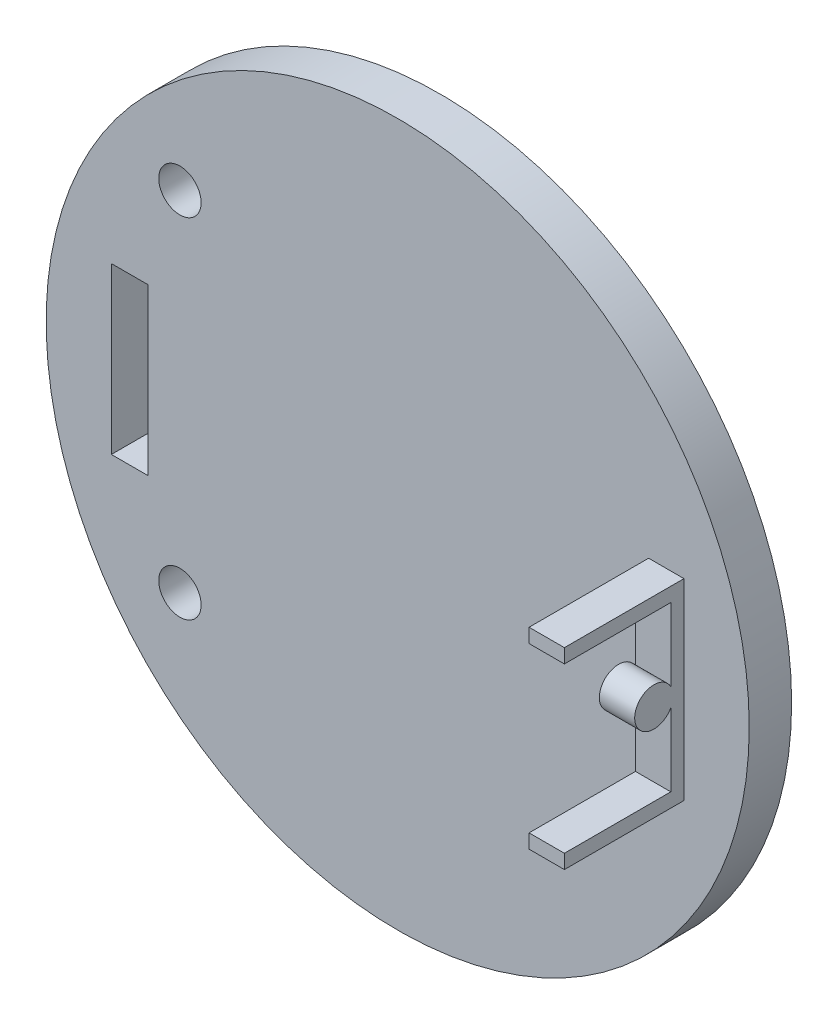
ISO-10303-21;
HEADER;
FILE_DESCRIPTION(('STEP AP214'),'2;1');
FILE_NAME('part.step','',(''),(''),'','','');
FILE_SCHEMA(('AUTOMOTIVE_DESIGN { 1 0 10303 214 1 1 1 1 }'));
ENDSEC;
DATA;
#1=APPLICATION_CONTEXT('core data for automotive mechanical design processes');
#2=APPLICATION_PROTOCOL_DEFINITION('international standard','automotive_design',2000,#1);
#3=PRODUCT_CONTEXT('',#1,'mechanical');
#4=PRODUCT('Part','Part','',(#3));
#5=PRODUCT_RELATED_PRODUCT_CATEGORY('part','',(#4));
#6=PRODUCT_DEFINITION_FORMATION('','',#4);
#7=PRODUCT_DEFINITION_CONTEXT('part definition',#1,'design');
#8=PRODUCT_DEFINITION('design','',#6,#7);
#9=PRODUCT_DEFINITION_SHAPE('','',#8);
#10=(LENGTH_UNIT() NAMED_UNIT(*) SI_UNIT(.MILLI.,.METRE.));
#11=(NAMED_UNIT(*) PLANE_ANGLE_UNIT() SI_UNIT($,.RADIAN.));
#12=(NAMED_UNIT(*) SI_UNIT($,.STERADIAN.) SOLID_ANGLE_UNIT());
#13=UNCERTAINTY_MEASURE_WITH_UNIT(LENGTH_MEASURE(1.E-05),#10,'distance_accuracy_value','');
#14=(GEOMETRIC_REPRESENTATION_CONTEXT(3) GLOBAL_UNCERTAINTY_ASSIGNED_CONTEXT((#13)) GLOBAL_UNIT_ASSIGNED_CONTEXT((#10,
#11,#12)) REPRESENTATION_CONTEXT('',''));
#15=CARTESIAN_POINT('',(0.,0.,0.));
#16=DIRECTION('',(0.,0.,1.));
#17=DIRECTION('',(1.,0.,0.));
#18=AXIS2_PLACEMENT_3D('',#15,#16,#17);
#19=CARTESIAN_POINT('',(0.,0.,8.46));
#20=DIRECTION('',(0.,0.,-1.));
#21=DIRECTION('',(-1.,0.,0.));
#22=AXIS2_PLACEMENT_3D('',#19,#20,#21);
#23=PLANE('',#22);
#24=DIRECTION('',(1.,0.,0.));
#25=VECTOR('',#24,1.);
#26=CARTESIAN_POINT('',(3.92599913973473,-5.8,8.46));
#27=LINE('',#26,#25);
#28=CARTESIAN_POINT('',(17.755,-5.8,8.46));
#29=VERTEX_POINT('',#28);
#30=CARTESIAN_POINT('',(20.255,-5.8,8.46));
#31=VERTEX_POINT('',#30);
#32=EDGE_CURVE('E246',#29,#31,#27,.T.);
#33=ORIENTED_EDGE('',*,*,#32,.F.);
#34=DIRECTION('',(0.,-1.,0.));
#35=VECTOR('',#34,1.);
#36=CARTESIAN_POINT('',(17.755,6.8,8.46));
#37=LINE('',#36,#35);
#38=CARTESIAN_POINT('',(17.755,-6.8,8.46));
#39=VERTEX_POINT('',#38);
#40=EDGE_CURVE('E278',#29,#39,#37,.T.);
#41=ORIENTED_EDGE('',*,*,#40,.T.);
#42=DIRECTION('',(1.,0.,0.));
#43=VECTOR('',#42,1.);
#44=CARTESIAN_POINT('',(17.755,-6.8,8.46));
#45=LINE('',#44,#43);
#46=CARTESIAN_POINT('',(20.255,-6.8,8.46));
#47=VERTEX_POINT('',#46);
#48=EDGE_CURVE('E274',#39,#47,#45,.T.);
#49=ORIENTED_EDGE('',*,*,#48,.T.);
#50=DIRECTION('',(0.,-1.,0.));
#51=VECTOR('',#50,1.);
#52=CARTESIAN_POINT('',(20.255,6.8,8.46));
#53=LINE('',#52,#51);
#54=EDGE_CURVE('E268',#31,#47,#53,.T.);
#55=ORIENTED_EDGE('',*,*,#54,.F.);
#56=EDGE_LOOP('',(#33,#41,#49,#55));
#57=FACE_BOUND('',#56,.T.);
#58=ADVANCED_FACE('F39',(#57),#23,.F.);
#59=DIRECTION('',(1.,0.,0.));
#60=VECTOR('',#59,1.);
#61=CARTESIAN_POINT('',(3.92599913973473,5.8,8.46));
#62=LINE('',#61,#60);
#63=CARTESIAN_POINT('',(17.755,5.8,8.46));
#64=VERTEX_POINT('',#63);
#65=CARTESIAN_POINT('',(20.255,5.8,8.46));
#66=VERTEX_POINT('',#65);
#67=EDGE_CURVE('E249',#64,#66,#62,.T.);
#68=ORIENTED_EDGE('',*,*,#67,.T.);
#69=CARTESIAN_POINT('',(20.255,6.8,8.46));
#70=VERTEX_POINT('',#69);
#71=EDGE_CURVE('E270',#70,#66,#53,.T.);
#72=ORIENTED_EDGE('',*,*,#71,.F.);
#73=DIRECTION('',(1.,0.,0.));
#74=VECTOR('',#73,1.);
#75=CARTESIAN_POINT('',(17.755,6.8,8.46));
#76=LINE('',#75,#74);
#77=CARTESIAN_POINT('',(17.755,6.8,8.46));
#78=VERTEX_POINT('',#77);
#79=EDGE_CURVE('E264',#78,#70,#76,.T.);
#80=ORIENTED_EDGE('',*,*,#79,.F.);
#81=EDGE_CURVE('E279',#78,#64,#37,.T.);
#82=ORIENTED_EDGE('',*,*,#81,.T.);
#83=EDGE_LOOP('',(#68,#72,#80,#82));
#84=FACE_BOUND('',#83,.T.);
#85=ADVANCED_FACE('F326',(#84),#23,.F.);
#86=CARTESIAN_POINT('',(0.,0.,-3.));
#87=DIRECTION('',(0.,0.,1.));
#88=DIRECTION('',(1.,0.,0.));
#89=AXIS2_PLACEMENT_3D('',#86,#87,#88);
#90=CYLINDRICAL_SURFACE('',#89,24.875);
#91=CARTESIAN_POINT('',(0.,0.,-3.));
#92=DIRECTION('',(0.,0.,1.));
#93=DIRECTION('',(1.,0.,0.));
#94=AXIS2_PLACEMENT_3D('',#91,#92,#93);
#95=CIRCLE('',#94,24.875);
#96=CARTESIAN_POINT('',(24.875,0.,-3.));
#97=VERTEX_POINT('',#96);
#98=EDGE_CURVE('E11',#97,#97,#95,.T.);
#99=ORIENTED_EDGE('',*,*,#98,.T.);
#100=EDGE_LOOP('',(#99));
#101=FACE_BOUND('',#100,.T.);
#102=CARTESIAN_POINT('',(0.,0.,0.));
#103=DIRECTION('',(0.,0.,1.));
#104=DIRECTION('',(1.,0.,0.));
#105=AXIS2_PLACEMENT_3D('',#102,#103,#104);
#106=CIRCLE('',#105,24.875);
#107=CARTESIAN_POINT('',(24.875,0.,0.));
#108=VERTEX_POINT('',#107);
#109=EDGE_CURVE('E43',#108,#108,#106,.T.);
#110=ORIENTED_EDGE('',*,*,#109,.F.);
#111=EDGE_LOOP('',(#110));
#112=FACE_BOUND('',#111,.T.);
#113=ADVANCED_FACE('F41',(#101,#112),#90,.T.);
#114=CARTESIAN_POINT('',(0.,0.,-3.));
#115=DIRECTION('',(0.,0.,1.));
#116=DIRECTION('',(1.,0.,0.));
#117=AXIS2_PLACEMENT_3D('',#114,#115,#116);
#118=PLANE('',#117);
#119=DIRECTION('',(-1.,0.,0.));
#120=VECTOR('',#119,1.);
#121=CARTESIAN_POINT('',(0.,5.84999999999999,-3.));
#122=LINE('',#121,#120);
#123=CARTESIAN_POINT('',(-17.66,5.85,-3.));
#124=VERTEX_POINT('',#123);
#125=CARTESIAN_POINT('',(-20.26,5.85,-3.));
#126=VERTEX_POINT('',#125);
#127=EDGE_CURVE('E181',#124,#126,#122,.T.);
#128=ORIENTED_EDGE('',*,*,#127,.T.);
#129=DIRECTION('',(0.,-1.,0.));
#130=VECTOR('',#129,1.);
#131=CARTESIAN_POINT('',(-20.26,0.,-3.));
#132=LINE('',#131,#130);
#133=CARTESIAN_POINT('',(-20.26,-5.85,-3.));
#134=VERTEX_POINT('',#133);
#135=EDGE_CURVE('E185',#126,#134,#132,.T.);
#136=ORIENTED_EDGE('',*,*,#135,.T.);
#137=DIRECTION('',(1.,0.,0.));
#138=VECTOR('',#137,1.);
#139=CARTESIAN_POINT('',(0.,-5.85,-3.));
#140=LINE('',#139,#138);
#141=CARTESIAN_POINT('',(-17.66,-5.85,-3.));
#142=VERTEX_POINT('',#141);
#143=EDGE_CURVE('E172',#134,#142,#140,.T.);
#144=ORIENTED_EDGE('',*,*,#143,.T.);
#145=DIRECTION('',(0.,1.,0.));
#146=VECTOR('',#145,1.);
#147=CARTESIAN_POINT('',(-17.66,0.,-3.));
#148=LINE('',#147,#146);
#149=EDGE_CURVE('E147',#142,#124,#148,.T.);
#150=ORIENTED_EDGE('',*,*,#149,.T.);
#151=EDGE_LOOP('',(#128,#136,#144,#150));
#152=FACE_BOUND('',#151,.T.);
#153=CARTESIAN_POINT('',(-15.4092069314207,12.7514449398056,-3.));
#154=DIRECTION('',(0.,0.,1.));
#155=DIRECTION('',(1.,0.,0.));
#156=AXIS2_PLACEMENT_3D('',#153,#154,#155);
#157=CIRCLE('',#156,1.5);
#158=CARTESIAN_POINT('',(-13.9092069314207,12.7514449398056,-3.));
#159=VERTEX_POINT('',#158);
#160=EDGE_CURVE('E201',#159,#159,#157,.T.);
#161=ORIENTED_EDGE('',*,*,#160,.T.);
#162=EDGE_LOOP('',(#161));
#163=FACE_BOUND('',#162,.T.);
#164=CARTESIAN_POINT('',(-15.4092069314207,-11.8993191986614,-3.));
#165=DIRECTION('',(0.,0.,1.));
#166=DIRECTION('',(1.,0.,0.));
#167=AXIS2_PLACEMENT_3D('',#164,#165,#166);
#168=CIRCLE('',#167,1.5);
#169=CARTESIAN_POINT('',(-13.9092069314207,-11.8993191986614,-3.));
#170=VERTEX_POINT('',#169);
#171=EDGE_CURVE('E194',#170,#170,#168,.T.);
#172=ORIENTED_EDGE('',*,*,#171,.T.);
#173=EDGE_LOOP('',(#172));
#174=FACE_BOUND('',#173,.T.);
#175=ORIENTED_EDGE('',*,*,#98,.F.);
#176=EDGE_LOOP('',(#175));
#177=FACE_BOUND('',#176,.T.);
#178=ADVANCED_FACE('F401',(#152,#163,#174,#177),#118,.F.);
#179=CARTESIAN_POINT('',(0.,0.,0.));
#180=DIRECTION('',(0.,0.,1.));
#181=DIRECTION('',(1.,0.,0.));
#182=AXIS2_PLACEMENT_3D('',#179,#180,#181);
#183=PLANE('',#182);
#184=DIRECTION('',(0.,-1.,0.));
#185=VECTOR('',#184,1.);
#186=CARTESIAN_POINT('',(-20.26,5.85,0.));
#187=LINE('',#186,#185);
#188=CARTESIAN_POINT('',(-20.26,5.85,0.));
#189=VERTEX_POINT('',#188);
#190=CARTESIAN_POINT('',(-20.26,-5.85,0.));
#191=VERTEX_POINT('',#190);
#192=EDGE_CURVE('E63',#189,#191,#187,.T.);
#193=ORIENTED_EDGE('',*,*,#192,.F.);
#194=DIRECTION('',(-1.,0.,0.));
#195=VECTOR('',#194,1.);
#196=CARTESIAN_POINT('',(-20.26,5.85,0.));
#197=LINE('',#196,#195);
#198=CARTESIAN_POINT('',(-17.66,5.85,0.));
#199=VERTEX_POINT('',#198);
#200=EDGE_CURVE('E162',#199,#189,#197,.T.);
#201=ORIENTED_EDGE('',*,*,#200,.F.);
#202=DIRECTION('',(0.,1.,0.));
#203=VECTOR('',#202,1.);
#204=CARTESIAN_POINT('',(-17.66,5.85,0.));
#205=LINE('',#204,#203);
#206=CARTESIAN_POINT('',(-17.66,-5.85,0.));
#207=VERTEX_POINT('',#206);
#208=EDGE_CURVE('E144',#207,#199,#205,.T.);
#209=ORIENTED_EDGE('',*,*,#208,.F.);
#210=DIRECTION('',(1.,0.,0.));
#211=VECTOR('',#210,1.);
#212=CARTESIAN_POINT('',(-20.26,-5.85,0.));
#213=LINE('',#212,#211);
#214=EDGE_CURVE('E154',#191,#207,#213,.T.);
#215=ORIENTED_EDGE('',*,*,#214,.F.);
#216=EDGE_LOOP('',(#193,#201,#209,#215));
#217=FACE_BOUND('',#216,.T.);
#218=CARTESIAN_POINT('',(-15.4092069314207,12.7514449398056,0.));
#219=DIRECTION('',(0.,0.,1.));
#220=DIRECTION('',(1.,0.,0.));
#221=AXIS2_PLACEMENT_3D('',#218,#219,#220);
#222=CIRCLE('',#221,1.5);
#223=CARTESIAN_POINT('',(-13.9092069314207,12.7514449398056,0.));
#224=VERTEX_POINT('',#223);
#225=EDGE_CURVE('E190',#224,#224,#222,.T.);
#226=ORIENTED_EDGE('',*,*,#225,.F.);
#227=EDGE_LOOP('',(#226));
#228=FACE_BOUND('',#227,.T.);
#229=CARTESIAN_POINT('',(-15.4092069314207,-11.8993191986614,0.));
#230=DIRECTION('',(0.,0.,1.));
#231=DIRECTION('',(1.,0.,0.));
#232=AXIS2_PLACEMENT_3D('',#229,#230,#231);
#233=CIRCLE('',#232,1.5);
#234=CARTESIAN_POINT('',(-13.9092069314207,-11.8993191986614,0.));
#235=VERTEX_POINT('',#234);
#236=EDGE_CURVE('E189',#235,#235,#233,.T.);
#237=ORIENTED_EDGE('',*,*,#236,.F.);
#238=EDGE_LOOP('',(#237));
#239=FACE_BOUND('',#238,.T.);
#240=DIRECTION('',(1.,0.,0.));
#241=VECTOR('',#240,1.);
#242=CARTESIAN_POINT('',(17.755,6.8,0.));
#243=LINE('',#242,#241);
#244=CARTESIAN_POINT('',(17.755,6.8,0.));
#245=VERTEX_POINT('',#244);
#246=CARTESIAN_POINT('',(20.255,6.8,0.));
#247=VERTEX_POINT('',#246);
#248=EDGE_CURVE('E263',#245,#247,#243,.T.);
#249=ORIENTED_EDGE('',*,*,#248,.T.);
#250=DIRECTION('',(0.,-1.,0.));
#251=VECTOR('',#250,1.);
#252=CARTESIAN_POINT('',(20.255,6.8,0.));
#253=LINE('',#252,#251);
#254=CARTESIAN_POINT('',(20.255,-6.8,0.));
#255=VERTEX_POINT('',#254);
#256=EDGE_CURVE('E286',#247,#255,#253,.T.);
#257=ORIENTED_EDGE('',*,*,#256,.T.);
#258=DIRECTION('',(1.,0.,0.));
#259=VECTOR('',#258,1.);
#260=CARTESIAN_POINT('',(17.755,-6.8,0.));
#261=LINE('',#260,#259);
#262=CARTESIAN_POINT('',(17.755,-6.8,0.));
#263=VERTEX_POINT('',#262);
#264=EDGE_CURVE('E289',#263,#255,#261,.T.);
#265=ORIENTED_EDGE('',*,*,#264,.F.);
#266=DIRECTION('',(0.,-1.,0.));
#267=VECTOR('',#266,1.);
#268=CARTESIAN_POINT('',(17.755,6.8,0.));
#269=LINE('',#268,#267);
#270=EDGE_CURVE('E269',#245,#263,#269,.T.);
#271=ORIENTED_EDGE('',*,*,#270,.F.);
#272=EDGE_LOOP('',(#249,#257,#265,#271));
#273=FACE_BOUND('',#272,.T.);
#274=ORIENTED_EDGE('',*,*,#109,.T.);
#275=EDGE_LOOP('',(#274));
#276=FACE_BOUND('',#275,.T.);
#277=ADVANCED_FACE('F159',(#217,#228,#239,#273,#276),#183,.T.);
#278=CARTESIAN_POINT('',(17.755,6.8,8.46));
#279=DIRECTION('',(0.,1.,0.));
#280=DIRECTION('',(-1.,0.,0.));
#281=AXIS2_PLACEMENT_3D('',#278,#279,#280);
#282=PLANE('',#281);
#283=ORIENTED_EDGE('',*,*,#248,.F.);
#284=DIRECTION('',(0.,0.,-1.));
#285=VECTOR('',#284,1.);
#286=CARTESIAN_POINT('',(17.755,6.8,8.46));
#287=LINE('',#286,#285);
#288=EDGE_CURVE('E296',#78,#245,#287,.T.);
#289=ORIENTED_EDGE('',*,*,#288,.F.);
#290=ORIENTED_EDGE('',*,*,#79,.T.);
#291=DIRECTION('',(0.,0.,-1.));
#292=VECTOR('',#291,1.);
#293=CARTESIAN_POINT('',(20.255,6.8,8.46));
#294=LINE('',#293,#292);
#295=EDGE_CURVE('E283',#70,#247,#294,.T.);
#296=ORIENTED_EDGE('',*,*,#295,.T.);
#297=EDGE_LOOP('',(#283,#289,#290,#296));
#298=FACE_BOUND('',#297,.T.);
#299=ADVANCED_FACE('F313',(#298),#282,.T.);
#300=CARTESIAN_POINT('',(17.755,6.8,8.46));
#301=DIRECTION('',(1.,0.,0.));
#302=DIRECTION('',(0.,1.,0.));
#303=AXIS2_PLACEMENT_3D('',#300,#301,#302);
#304=PLANE('',#303);
#305=DIRECTION('',(0.,0.,-1.));
#306=VECTOR('',#305,1.);
#307=CARTESIAN_POINT('',(17.755,-5.8,0.));
#308=LINE('',#307,#306);
#309=CARTESIAN_POINT('',(17.755,-5.8,0.931303911485231));
#310=VERTEX_POINT('',#309);
#311=EDGE_CURVE('E215',#29,#310,#308,.T.);
#312=ORIENTED_EDGE('',*,*,#311,.T.);
#313=DIRECTION('',(0.,1.,0.));
#314=VECTOR('',#313,1.);
#315=CARTESIAN_POINT('',(17.755,0.,0.931303911485232));
#316=LINE('',#315,#314);
#317=CARTESIAN_POINT('',(17.755,-0.649999999999997,0.931303911485233));
#318=VERTEX_POINT('',#317);
#319=EDGE_CURVE('E219',#310,#318,#316,.T.);
#320=ORIENTED_EDGE('',*,*,#319,.T.);
#321=CARTESIAN_POINT('',(17.755,0.,2.12591681950188));
#322=DIRECTION('',(1.,0.,0.));
#323=DIRECTION('',(0.,1.,0.));
#324=AXIS2_PLACEMENT_3D('',#321,#322,#323);
#325=CIRCLE('',#324,1.36);
#326=CARTESIAN_POINT('',(17.755,0.650000000000004,0.931303911485232));
#327=VERTEX_POINT('',#326);
#328=EDGE_CURVE('E223',#327,#318,#325,.T.);
#329=ORIENTED_EDGE('',*,*,#328,.F.);
#330=DIRECTION('',(0.,1.,0.));
#331=VECTOR('',#330,1.);
#332=CARTESIAN_POINT('',(17.755,0.,0.931303911485232));
#333=LINE('',#332,#331);
#334=CARTESIAN_POINT('',(17.755,5.8,0.931303911485232));
#335=VERTEX_POINT('',#334);
#336=EDGE_CURVE('E206',#327,#335,#333,.T.);
#337=ORIENTED_EDGE('',*,*,#336,.T.);
#338=DIRECTION('',(0.,0.,1.));
#339=VECTOR('',#338,1.);
#340=CARTESIAN_POINT('',(17.755,5.8,0.));
#341=LINE('',#340,#339);
#342=EDGE_CURVE('E210',#335,#64,#341,.T.);
#343=ORIENTED_EDGE('',*,*,#342,.T.);
#344=ORIENTED_EDGE('',*,*,#81,.F.);
#345=ORIENTED_EDGE('',*,*,#288,.T.);
#346=ORIENTED_EDGE('',*,*,#270,.T.);
#347=DIRECTION('',(0.,0.,-1.));
#348=VECTOR('',#347,1.);
#349=CARTESIAN_POINT('',(17.755,-6.8,8.46));
#350=LINE('',#349,#348);
#351=EDGE_CURVE('E300',#39,#263,#350,.T.);
#352=ORIENTED_EDGE('',*,*,#351,.F.);
#353=ORIENTED_EDGE('',*,*,#40,.F.);
#354=EDGE_LOOP('',(#312,#320,#329,#337,#343,#344,#345,#346,#352,#353));
#355=FACE_BOUND('',#354,.T.);
#356=ADVANCED_FACE('F324',(#355),#304,.F.);
#357=CARTESIAN_POINT('',(17.755,-6.8,8.46));
#358=DIRECTION('',(0.,1.,0.));
#359=DIRECTION('',(-1.,0.,0.));
#360=AXIS2_PLACEMENT_3D('',#357,#358,#359);
#361=PLANE('',#360);
#362=ORIENTED_EDGE('',*,*,#264,.T.);
#363=DIRECTION('',(0.,0.,-1.));
#364=VECTOR('',#363,1.);
#365=CARTESIAN_POINT('',(20.255,-6.8,8.46));
#366=LINE('',#365,#364);
#367=EDGE_CURVE('E304',#47,#255,#366,.T.);
#368=ORIENTED_EDGE('',*,*,#367,.F.);
#369=ORIENTED_EDGE('',*,*,#48,.F.);
#370=ORIENTED_EDGE('',*,*,#351,.T.);
#371=EDGE_LOOP('',(#362,#368,#369,#370));
#372=FACE_BOUND('',#371,.T.);
#373=ADVANCED_FACE('F354',(#372),#361,.F.);
#374=CARTESIAN_POINT('',(20.255,6.8,8.46));
#375=DIRECTION('',(1.,0.,0.));
#376=DIRECTION('',(0.,1.,0.));
#377=AXIS2_PLACEMENT_3D('',#374,#375,#376);
#378=PLANE('',#377);
#379=DIRECTION('',(0.,-1.,0.));
#380=VECTOR('',#379,1.);
#381=CARTESIAN_POINT('',(20.255,0.,0.931303911485232));
#382=LINE('',#381,#380);
#383=CARTESIAN_POINT('',(20.255,-0.649999999999995,0.931303911485232));
#384=VERTEX_POINT('',#383);
#385=CARTESIAN_POINT('',(20.255,-5.8,0.931303911485231));
#386=VERTEX_POINT('',#385);
#387=EDGE_CURVE('E205',#384,#386,#382,.T.);
#388=ORIENTED_EDGE('',*,*,#387,.T.);
#389=DIRECTION('',(0.,0.,1.));
#390=VECTOR('',#389,1.);
#391=CARTESIAN_POINT('',(20.255,-5.8,0.));
#392=LINE('',#391,#390);
#393=EDGE_CURVE('E239',#386,#31,#392,.T.);
#394=ORIENTED_EDGE('',*,*,#393,.T.);
#395=ORIENTED_EDGE('',*,*,#54,.T.);
#396=ORIENTED_EDGE('',*,*,#367,.T.);
#397=ORIENTED_EDGE('',*,*,#256,.F.);
#398=ORIENTED_EDGE('',*,*,#295,.F.);
#399=ORIENTED_EDGE('',*,*,#71,.T.);
#400=DIRECTION('',(0.,0.,-1.));
#401=VECTOR('',#400,1.);
#402=CARTESIAN_POINT('',(20.255,5.8,0.));
#403=LINE('',#402,#401);
#404=CARTESIAN_POINT('',(20.255,5.8,0.931303911485232));
#405=VERTEX_POINT('',#404);
#406=EDGE_CURVE('E235',#66,#405,#403,.T.);
#407=ORIENTED_EDGE('',*,*,#406,.T.);
#408=DIRECTION('',(0.,-1.,0.));
#409=VECTOR('',#408,1.);
#410=CARTESIAN_POINT('',(20.255,0.,0.931303911485232));
#411=LINE('',#410,#409);
#412=CARTESIAN_POINT('',(20.255,0.650000000000005,0.931303911485232));
#413=VERTEX_POINT('',#412);
#414=EDGE_CURVE('E231',#405,#413,#411,.T.);
#415=ORIENTED_EDGE('',*,*,#414,.T.);
#416=CARTESIAN_POINT('',(20.255,0.,2.12591681950188));
#417=DIRECTION('',(1.,0.,0.));
#418=DIRECTION('',(0.,1.,0.));
#419=AXIS2_PLACEMENT_3D('',#416,#417,#418);
#420=CIRCLE('',#419,1.36);
#421=EDGE_CURVE('E227',#384,#413,#420,.F.);
#422=ORIENTED_EDGE('',*,*,#421,.F.);
#423=EDGE_LOOP('',(#388,#394,#395,#396,#397,#398,#399,#407,#415,#422));
#424=FACE_BOUND('',#423,.T.);
#425=ADVANCED_FACE('F317',(#424),#378,.T.);
#426=CARTESIAN_POINT('',(3.92599913973473,0.,0.931303911485232));
#427=DIRECTION('',(0.,0.,1.));
#428=DIRECTION('',(0.,-1.,0.));
#429=AXIS2_PLACEMENT_3D('',#426,#427,#428);
#430=PLANE('',#429);
#431=DIRECTION('',(1.,0.,0.));
#432=VECTOR('',#431,1.);
#433=CARTESIAN_POINT('',(3.92599913973473,-5.8,0.931303911485231));
#434=LINE('',#433,#432);
#435=EDGE_CURVE('E211',#310,#386,#434,.T.);
#436=ORIENTED_EDGE('',*,*,#435,.T.);
#437=ORIENTED_EDGE('',*,*,#387,.F.);
#438=DIRECTION('',(1.,0.,0.));
#439=VECTOR('',#438,1.);
#440=CARTESIAN_POINT('',(3.92599913973473,-0.65,0.931303911485232));
#441=LINE('',#440,#439);
#442=EDGE_CURVE('E243',#318,#384,#441,.T.);
#443=ORIENTED_EDGE('',*,*,#442,.F.);
#444=ORIENTED_EDGE('',*,*,#319,.F.);
#445=EDGE_LOOP('',(#436,#437,#443,#444));
#446=FACE_BOUND('',#445,.T.);
#447=ADVANCED_FACE('F343',(#446),#430,.T.);
#448=CARTESIAN_POINT('',(3.92599913973473,-5.8,0.));
#449=DIRECTION('',(0.,1.,0.));
#450=DIRECTION('',(-1.,0.,0.));
#451=AXIS2_PLACEMENT_3D('',#448,#449,#450);
#452=PLANE('',#451);
#453=ORIENTED_EDGE('',*,*,#32,.T.);
#454=ORIENTED_EDGE('',*,*,#393,.F.);
#455=ORIENTED_EDGE('',*,*,#435,.F.);
#456=ORIENTED_EDGE('',*,*,#311,.F.);
#457=EDGE_LOOP('',(#453,#454,#455,#456));
#458=FACE_BOUND('',#457,.T.);
#459=ADVANCED_FACE('F346',(#458),#452,.T.);
#460=CARTESIAN_POINT('',(3.92599913973473,5.8,0.));
#461=DIRECTION('',(0.,-1.,0.));
#462=DIRECTION('',(1.,0.,0.));
#463=AXIS2_PLACEMENT_3D('',#460,#461,#462);
#464=PLANE('',#463);
#465=DIRECTION('',(1.,0.,0.));
#466=VECTOR('',#465,1.);
#467=CARTESIAN_POINT('',(3.92599913973473,5.8,0.931303911485232));
#468=LINE('',#467,#466);
#469=EDGE_CURVE('E253',#335,#405,#468,.T.);
#470=ORIENTED_EDGE('',*,*,#469,.T.);
#471=ORIENTED_EDGE('',*,*,#406,.F.);
#472=ORIENTED_EDGE('',*,*,#67,.F.);
#473=ORIENTED_EDGE('',*,*,#342,.F.);
#474=EDGE_LOOP('',(#470,#471,#472,#473));
#475=FACE_BOUND('',#474,.T.);
#476=ADVANCED_FACE('F330',(#475),#464,.T.);
#477=CARTESIAN_POINT('',(3.92599913973473,0.,0.931303911485232));
#478=DIRECTION('',(0.,0.,1.));
#479=DIRECTION('',(0.,-1.,0.));
#480=AXIS2_PLACEMENT_3D('',#477,#478,#479);
#481=PLANE('',#480);
#482=DIRECTION('',(1.,0.,0.));
#483=VECTOR('',#482,1.);
#484=CARTESIAN_POINT('',(3.92599913973473,0.65,0.931303911485232));
#485=LINE('',#484,#483);
#486=EDGE_CURVE('E256',#327,#413,#485,.T.);
#487=ORIENTED_EDGE('',*,*,#486,.T.);
#488=ORIENTED_EDGE('',*,*,#414,.F.);
#489=ORIENTED_EDGE('',*,*,#469,.F.);
#490=ORIENTED_EDGE('',*,*,#336,.F.);
#491=EDGE_LOOP('',(#487,#488,#489,#490));
#492=FACE_BOUND('',#491,.T.);
#493=ADVANCED_FACE('F333',(#492),#481,.T.);
#494=CARTESIAN_POINT('',(3.92599913973473,0.,2.12591681950188));
#495=DIRECTION('',(1.,0.,0.));
#496=DIRECTION('',(0.,1.,0.));
#497=AXIS2_PLACEMENT_3D('',#494,#495,#496);
#498=CYLINDRICAL_SURFACE('',#497,1.36);
#499=ORIENTED_EDGE('',*,*,#328,.T.);
#500=ORIENTED_EDGE('',*,*,#442,.T.);
#501=ORIENTED_EDGE('',*,*,#421,.T.);
#502=ORIENTED_EDGE('',*,*,#486,.F.);
#503=EDGE_LOOP('',(#499,#500,#501,#502));
#504=FACE_BOUND('',#503,.T.);
#505=ADVANCED_FACE('F337',(#504),#498,.T.);
#506=CARTESIAN_POINT('',(-15.4092069314207,-11.8993191986614,-4.95));
#507=DIRECTION('',(0.,0.,1.));
#508=DIRECTION('',(1.,0.,0.));
#509=AXIS2_PLACEMENT_3D('',#506,#507,#508);
#510=CYLINDRICAL_SURFACE('',#509,1.5);
#511=CARTESIAN_POINT('',(-13.9092069314207,-11.8993191986614,0.));
#512=CARTESIAN_POINT('',(-13.9092069314207,-11.8993191986614,-0.03125));
#513=CARTESIAN_POINT('',(-13.9092069314207,-11.8993191986614,-0.0625000000000001));
#514=CARTESIAN_POINT('',(-13.9092069314207,-11.8993191986614,-0.125));
#515=CARTESIAN_POINT('',(-13.9092069314207,-11.8993191986614,-0.15625));
#516=CARTESIAN_POINT('',(-13.9092069314207,-11.8993191986614,-0.21875));
#517=CARTESIAN_POINT('',(-13.9092069314207,-11.8993191986614,-0.25));
#518=CARTESIAN_POINT('',(-13.9092069314207,-11.8993191986614,-0.3125));
#519=CARTESIAN_POINT('',(-13.9092069314207,-11.8993191986614,-0.34375));
#520=CARTESIAN_POINT('',(-13.9092069314207,-11.8993191986614,-0.40625));
#521=CARTESIAN_POINT('',(-13.9092069314207,-11.8993191986614,-0.4375));
#522=CARTESIAN_POINT('',(-13.9092069314207,-11.8993191986614,-0.5));
#523=CARTESIAN_POINT('',(-13.9092069314207,-11.8993191986614,-0.53125));
#524=CARTESIAN_POINT('',(-13.9092069314207,-11.8993191986614,-0.593750000000001));
#525=CARTESIAN_POINT('',(-13.9092069314207,-11.8993191986614,-0.625000000000001));
#526=CARTESIAN_POINT('',(-13.9092069314207,-11.8993191986614,-0.687500000000001));
#527=CARTESIAN_POINT('',(-13.9092069314207,-11.8993191986614,-0.718750000000001));
#528=CARTESIAN_POINT('',(-13.9092069314207,-11.8993191986614,-0.781250000000001));
#529=CARTESIAN_POINT('',(-13.9092069314207,-11.8993191986614,-0.812500000000001));
#530=CARTESIAN_POINT('',(-13.9092069314207,-11.8993191986614,-0.875));
#531=CARTESIAN_POINT('',(-13.9092069314207,-11.8993191986614,-0.90625));
#532=CARTESIAN_POINT('',(-13.9092069314207,-11.8993191986614,-0.96875));
#533=CARTESIAN_POINT('',(-13.9092069314207,-11.8993191986614,-1.));
#534=CARTESIAN_POINT('',(-13.9092069314207,-11.8993191986614,-1.0625));
#535=CARTESIAN_POINT('',(-13.9092069314207,-11.8993191986614,-1.09375));
#536=CARTESIAN_POINT('',(-13.9092069314207,-11.8993191986614,-1.15625));
#537=CARTESIAN_POINT('',(-13.9092069314207,-11.8993191986614,-1.1875));
#538=CARTESIAN_POINT('',(-13.9092069314207,-11.8993191986614,-1.25));
#539=CARTESIAN_POINT('',(-13.9092069314207,-11.8993191986614,-1.28125));
#540=CARTESIAN_POINT('',(-13.9092069314207,-11.8993191986614,-1.34375));
#541=CARTESIAN_POINT('',(-13.9092069314207,-11.8993191986614,-1.375));
#542=CARTESIAN_POINT('',(-13.9092069314207,-11.8993191986614,-1.4375));
#543=CARTESIAN_POINT('',(-13.9092069314207,-11.8993191986614,-1.46875));
#544=CARTESIAN_POINT('',(-13.9092069314207,-11.8993191986614,-1.53125));
#545=CARTESIAN_POINT('',(-13.9092069314207,-11.8993191986614,-1.5625));
#546=CARTESIAN_POINT('',(-13.9092069314207,-11.8993191986614,-1.625));
#547=CARTESIAN_POINT('',(-13.9092069314207,-11.8993191986614,-1.65625));
#548=CARTESIAN_POINT('',(-13.9092069314207,-11.8993191986614,-1.71875));
#549=CARTESIAN_POINT('',(-13.9092069314207,-11.8993191986614,-1.75));
#550=CARTESIAN_POINT('',(-13.9092069314207,-11.8993191986614,-1.8125));
#551=CARTESIAN_POINT('',(-13.9092069314207,-11.8993191986614,-1.84375));
#552=CARTESIAN_POINT('',(-13.9092069314207,-11.8993191986614,-1.90625));
#553=CARTESIAN_POINT('',(-13.9092069314207,-11.8993191986614,-1.9375));
#554=CARTESIAN_POINT('',(-13.9092069314207,-11.8993191986614,-2.));
#555=CARTESIAN_POINT('',(-13.9092069314207,-11.8993191986614,-2.03125));
#556=CARTESIAN_POINT('',(-13.9092069314207,-11.8993191986614,-2.09375));
#557=CARTESIAN_POINT('',(-13.9092069314207,-11.8993191986614,-2.125));
#558=CARTESIAN_POINT('',(-13.9092069314207,-11.8993191986614,-2.1875));
#559=CARTESIAN_POINT('',(-13.9092069314207,-11.8993191986614,-2.21875));
#560=CARTESIAN_POINT('',(-13.9092069314207,-11.8993191986614,-2.28125));
#561=CARTESIAN_POINT('',(-13.9092069314207,-11.8993191986614,-2.3125));
#562=CARTESIAN_POINT('',(-13.9092069314207,-11.8993191986614,-2.375));
#563=CARTESIAN_POINT('',(-13.9092069314207,-11.8993191986614,-2.40625));
#564=CARTESIAN_POINT('',(-13.9092069314207,-11.8993191986614,-2.46875));
#565=CARTESIAN_POINT('',(-13.9092069314207,-11.8993191986614,-2.5));
#566=CARTESIAN_POINT('',(-13.9092069314207,-11.8993191986614,-2.5625));
#567=CARTESIAN_POINT('',(-13.9092069314207,-11.8993191986614,-2.59375));
#568=CARTESIAN_POINT('',(-13.9092069314207,-11.8993191986614,-2.65625));
#569=CARTESIAN_POINT('',(-13.9092069314207,-11.8993191986614,-2.6875));
#570=CARTESIAN_POINT('',(-13.9092069314207,-11.8993191986614,-2.75));
#571=CARTESIAN_POINT('',(-13.9092069314207,-11.8993191986614,-2.78125));
#572=CARTESIAN_POINT('',(-13.9092069314207,-11.8993191986614,-2.84375));
#573=CARTESIAN_POINT('',(-13.9092069314207,-11.8993191986614,-2.875));
#574=CARTESIAN_POINT('',(-13.9092069314207,-11.8993191986614,-2.9375));
#575=CARTESIAN_POINT('',(-13.9092069314207,-11.8993191986614,-2.96875));
#576=CARTESIAN_POINT('',(-13.9092069314207,-11.8993191986614,-3.));
#577=B_SPLINE_CURVE_WITH_KNOTS('',3,(#511,#512,#513,#514,#515,#516,#517,#518,#519,#520,#521,
#522,#523,#524,#525,#526,#527,#528,#529,#530,#531,#532,#533,#534,#535,#536,#537,#538,#539,#540,
#541,#542,#543,#544,#545,#546,#547,#548,#549,#550,#551,#552,#553,#554,#555,#556,#557,#558,#559,
#560,#561,#562,#563,#564,#565,#566,#567,#568,#569,#570,#571,#572,#573,#574,#575,#576),
.UNSPECIFIED.,.F.,.F.,(4,2,2,2,2,2,2,2,2,2,2,2,2,2,2,2,2,2,2,2,2,2,2,2,2,2,2,2,2,2,2,2,4),(0.,
0.0937500000000001,0.1875,0.28125,0.375,0.46875,0.5625,0.656250000000001,0.750000000000001,
0.843750000000001,0.9375,1.03125,1.125,1.21875,1.3125,1.40625,1.5,1.59375,1.6875,1.78125,1.875,
1.96875,2.0625,2.15625,2.25,2.34375,2.4375,2.53125,2.625,2.71875,2.8125,2.90625,3.),.UNSPECIFIED.);
#578=EDGE_CURVE('BSEAM373',#235,#170,#577,.T.);
#579=ORIENTED_EDGE('',*,*,#236,.T.);
#580=ORIENTED_EDGE('',*,*,#171,.F.);
#581=ORIENTED_EDGE('',*,*,#578,.T.);
#582=ORIENTED_EDGE('',*,*,#578,.F.);
#583=EDGE_LOOP('',(#579,#581,#580,#582));
#584=FACE_BOUND('',#583,.T.);
#585=ADVANCED_FACE('F373',(#584),#510,.F.);
#586=CARTESIAN_POINT('',(-15.4092069314207,12.7514449398056,-4.95));
#587=DIRECTION('',(0.,0.,1.));
#588=DIRECTION('',(1.,0.,0.));
#589=AXIS2_PLACEMENT_3D('',#586,#587,#588);
#590=CYLINDRICAL_SURFACE('',#589,1.5);
#591=CARTESIAN_POINT('',(-13.9092069314207,12.7514449398056,0.));
#592=CARTESIAN_POINT('',(-13.9092069314207,12.7514449398056,-0.03125));
#593=CARTESIAN_POINT('',(-13.9092069314207,12.7514449398056,-0.0625000000000001));
#594=CARTESIAN_POINT('',(-13.9092069314207,12.7514449398056,-0.125));
#595=CARTESIAN_POINT('',(-13.9092069314207,12.7514449398056,-0.15625));
#596=CARTESIAN_POINT('',(-13.9092069314207,12.7514449398056,-0.21875));
#597=CARTESIAN_POINT('',(-13.9092069314207,12.7514449398056,-0.25));
#598=CARTESIAN_POINT('',(-13.9092069314207,12.7514449398056,-0.3125));
#599=CARTESIAN_POINT('',(-13.9092069314207,12.7514449398056,-0.34375));
#600=CARTESIAN_POINT('',(-13.9092069314207,12.7514449398056,-0.40625));
#601=CARTESIAN_POINT('',(-13.9092069314207,12.7514449398056,-0.4375));
#602=CARTESIAN_POINT('',(-13.9092069314207,12.7514449398056,-0.5));
#603=CARTESIAN_POINT('',(-13.9092069314207,12.7514449398056,-0.53125));
#604=CARTESIAN_POINT('',(-13.9092069314207,12.7514449398056,-0.593750000000001));
#605=CARTESIAN_POINT('',(-13.9092069314207,12.7514449398056,-0.625000000000001));
#606=CARTESIAN_POINT('',(-13.9092069314207,12.7514449398056,-0.687500000000001));
#607=CARTESIAN_POINT('',(-13.9092069314207,12.7514449398056,-0.718750000000001));
#608=CARTESIAN_POINT('',(-13.9092069314207,12.7514449398056,-0.781250000000001));
#609=CARTESIAN_POINT('',(-13.9092069314207,12.7514449398056,-0.812500000000001));
#610=CARTESIAN_POINT('',(-13.9092069314207,12.7514449398056,-0.875));
#611=CARTESIAN_POINT('',(-13.9092069314207,12.7514449398056,-0.90625));
#612=CARTESIAN_POINT('',(-13.9092069314207,12.7514449398056,-0.96875));
#613=CARTESIAN_POINT('',(-13.9092069314207,12.7514449398056,-1.));
#614=CARTESIAN_POINT('',(-13.9092069314207,12.7514449398056,-1.0625));
#615=CARTESIAN_POINT('',(-13.9092069314207,12.7514449398056,-1.09375));
#616=CARTESIAN_POINT('',(-13.9092069314207,12.7514449398056,-1.15625));
#617=CARTESIAN_POINT('',(-13.9092069314207,12.7514449398056,-1.1875));
#618=CARTESIAN_POINT('',(-13.9092069314207,12.7514449398056,-1.25));
#619=CARTESIAN_POINT('',(-13.9092069314207,12.7514449398056,-1.28125));
#620=CARTESIAN_POINT('',(-13.9092069314207,12.7514449398056,-1.34375));
#621=CARTESIAN_POINT('',(-13.9092069314207,12.7514449398056,-1.375));
#622=CARTESIAN_POINT('',(-13.9092069314207,12.7514449398056,-1.4375));
#623=CARTESIAN_POINT('',(-13.9092069314207,12.7514449398056,-1.46875));
#624=CARTESIAN_POINT('',(-13.9092069314207,12.7514449398056,-1.53125));
#625=CARTESIAN_POINT('',(-13.9092069314207,12.7514449398056,-1.5625));
#626=CARTESIAN_POINT('',(-13.9092069314207,12.7514449398056,-1.625));
#627=CARTESIAN_POINT('',(-13.9092069314207,12.7514449398056,-1.65625));
#628=CARTESIAN_POINT('',(-13.9092069314207,12.7514449398056,-1.71875));
#629=CARTESIAN_POINT('',(-13.9092069314207,12.7514449398056,-1.75));
#630=CARTESIAN_POINT('',(-13.9092069314207,12.7514449398056,-1.8125));
#631=CARTESIAN_POINT('',(-13.9092069314207,12.7514449398056,-1.84375));
#632=CARTESIAN_POINT('',(-13.9092069314207,12.7514449398056,-1.90625));
#633=CARTESIAN_POINT('',(-13.9092069314207,12.7514449398056,-1.9375));
#634=CARTESIAN_POINT('',(-13.9092069314207,12.7514449398056,-2.));
#635=CARTESIAN_POINT('',(-13.9092069314207,12.7514449398056,-2.03125));
#636=CARTESIAN_POINT('',(-13.9092069314207,12.7514449398056,-2.09375));
#637=CARTESIAN_POINT('',(-13.9092069314207,12.7514449398056,-2.125));
#638=CARTESIAN_POINT('',(-13.9092069314207,12.7514449398056,-2.1875));
#639=CARTESIAN_POINT('',(-13.9092069314207,12.7514449398056,-2.21875));
#640=CARTESIAN_POINT('',(-13.9092069314207,12.7514449398056,-2.28125));
#641=CARTESIAN_POINT('',(-13.9092069314207,12.7514449398056,-2.3125));
#642=CARTESIAN_POINT('',(-13.9092069314207,12.7514449398056,-2.375));
#643=CARTESIAN_POINT('',(-13.9092069314207,12.7514449398056,-2.40625));
#644=CARTESIAN_POINT('',(-13.9092069314207,12.7514449398056,-2.46875));
#645=CARTESIAN_POINT('',(-13.9092069314207,12.7514449398056,-2.5));
#646=CARTESIAN_POINT('',(-13.9092069314207,12.7514449398056,-2.5625));
#647=CARTESIAN_POINT('',(-13.9092069314207,12.7514449398056,-2.59375));
#648=CARTESIAN_POINT('',(-13.9092069314207,12.7514449398056,-2.65625));
#649=CARTESIAN_POINT('',(-13.9092069314207,12.7514449398056,-2.6875));
#650=CARTESIAN_POINT('',(-13.9092069314207,12.7514449398056,-2.75));
#651=CARTESIAN_POINT('',(-13.9092069314207,12.7514449398056,-2.78125));
#652=CARTESIAN_POINT('',(-13.9092069314207,12.7514449398056,-2.84375));
#653=CARTESIAN_POINT('',(-13.9092069314207,12.7514449398056,-2.875));
#654=CARTESIAN_POINT('',(-13.9092069314207,12.7514449398056,-2.9375));
#655=CARTESIAN_POINT('',(-13.9092069314207,12.7514449398056,-2.96875));
#656=CARTESIAN_POINT('',(-13.9092069314207,12.7514449398056,-3.));
#657=B_SPLINE_CURVE_WITH_KNOTS('',3,(#591,#592,#593,#594,#595,#596,#597,#598,#599,#600,#601,
#602,#603,#604,#605,#606,#607,#608,#609,#610,#611,#612,#613,#614,#615,#616,#617,#618,#619,#620,
#621,#622,#623,#624,#625,#626,#627,#628,#629,#630,#631,#632,#633,#634,#635,#636,#637,#638,#639,
#640,#641,#642,#643,#644,#645,#646,#647,#648,#649,#650,#651,#652,#653,#654,#655,#656),
.UNSPECIFIED.,.F.,.F.,(4,2,2,2,2,2,2,2,2,2,2,2,2,2,2,2,2,2,2,2,2,2,2,2,2,2,2,2,2,2,2,2,4),(0.,
0.0937500000000001,0.1875,0.28125,0.375,0.46875,0.5625,0.656250000000001,0.750000000000001,
0.843750000000001,0.9375,1.03125,1.125,1.21875,1.3125,1.40625,1.5,1.59375,1.6875,1.78125,1.875,
1.96875,2.0625,2.15625,2.25,2.34375,2.4375,2.53125,2.625,2.71875,2.8125,2.90625,3.),.UNSPECIFIED.);
#658=EDGE_CURVE('BSEAM382',#224,#159,#657,.T.);
#659=ORIENTED_EDGE('',*,*,#225,.T.);
#660=ORIENTED_EDGE('',*,*,#160,.F.);
#661=ORIENTED_EDGE('',*,*,#658,.T.);
#662=ORIENTED_EDGE('',*,*,#658,.F.);
#663=EDGE_LOOP('',(#659,#661,#660,#662));
#664=FACE_BOUND('',#663,.T.);
#665=ADVANCED_FACE('F382',(#664),#590,.F.);
#666=CARTESIAN_POINT('',(-20.26,5.85,-4.95));
#667=DIRECTION('',(-1.,0.,0.));
#668=DIRECTION('',(0.,-1.,0.));
#669=AXIS2_PLACEMENT_3D('',#666,#667,#668);
#670=PLANE('',#669);
#671=DIRECTION('',(0.,0.,1.));
#672=VECTOR('',#671,1.);
#673=CARTESIAN_POINT('',(-20.26,5.85,-4.95));
#674=LINE('',#673,#672);
#675=EDGE_CURVE('E169',#126,#189,#674,.T.);
#676=ORIENTED_EDGE('',*,*,#675,.T.);
#677=ORIENTED_EDGE('',*,*,#192,.T.);
#678=DIRECTION('',(0.,0.,1.));
#679=VECTOR('',#678,1.);
#680=CARTESIAN_POINT('',(-20.26,-5.85,-4.95));
#681=LINE('',#680,#679);
#682=EDGE_CURVE('E151',#134,#191,#681,.T.);
#683=ORIENTED_EDGE('',*,*,#682,.F.);
#684=ORIENTED_EDGE('',*,*,#135,.F.);
#685=EDGE_LOOP('',(#676,#677,#683,#684));
#686=FACE_BOUND('',#685,.T.);
#687=ADVANCED_FACE('F386',(#686),#670,.F.);
#688=CARTESIAN_POINT('',(-20.26,5.85,-4.95));
#689=DIRECTION('',(0.,1.,0.));
#690=DIRECTION('',(-1.,0.,0.));
#691=AXIS2_PLACEMENT_3D('',#688,#689,#690);
#692=PLANE('',#691);
#693=DIRECTION('',(0.,0.,1.));
#694=VECTOR('',#693,1.);
#695=CARTESIAN_POINT('',(-17.66,5.85,-4.95));
#696=LINE('',#695,#694);
#697=EDGE_CURVE('E150',#124,#199,#696,.T.);
#698=ORIENTED_EDGE('',*,*,#697,.T.);
#699=ORIENTED_EDGE('',*,*,#200,.T.);
#700=ORIENTED_EDGE('',*,*,#675,.F.);
#701=ORIENTED_EDGE('',*,*,#127,.F.);
#702=EDGE_LOOP('',(#698,#699,#700,#701));
#703=FACE_BOUND('',#702,.T.);
#704=ADVANCED_FACE('F390',(#703),#692,.F.);
#705=CARTESIAN_POINT('',(-17.66,5.85,-4.95));
#706=DIRECTION('',(1.,0.,0.));
#707=DIRECTION('',(0.,0.,-1.));
#708=AXIS2_PLACEMENT_3D('',#705,#706,#707);
#709=PLANE('',#708);
#710=DIRECTION('',(0.,0.,1.));
#711=VECTOR('',#710,1.);
#712=CARTESIAN_POINT('',(-17.66,-5.85,-4.95));
#713=LINE('',#712,#711);
#714=EDGE_CURVE('E55',#142,#207,#713,.T.);
#715=ORIENTED_EDGE('',*,*,#714,.T.);
#716=ORIENTED_EDGE('',*,*,#208,.T.);
#717=ORIENTED_EDGE('',*,*,#697,.F.);
#718=ORIENTED_EDGE('',*,*,#149,.F.);
#719=EDGE_LOOP('',(#715,#716,#717,#718));
#720=FACE_BOUND('',#719,.T.);
#721=ADVANCED_FACE('F141',(#720),#709,.F.);
#722=CARTESIAN_POINT('',(-20.26,-5.85,-4.95));
#723=DIRECTION('',(0.,-1.,0.));
#724=DIRECTION('',(0.,0.,-1.));
#725=AXIS2_PLACEMENT_3D('',#722,#723,#724);
#726=PLANE('',#725);
#727=ORIENTED_EDGE('',*,*,#682,.T.);
#728=ORIENTED_EDGE('',*,*,#214,.T.);
#729=ORIENTED_EDGE('',*,*,#714,.F.);
#730=ORIENTED_EDGE('',*,*,#143,.F.);
#731=EDGE_LOOP('',(#727,#728,#729,#730));
#732=FACE_BOUND('',#731,.T.);
#733=ADVANCED_FACE('F155',(#732),#726,.F.);
#734=CLOSED_SHELL('',(#58,#85,#113,#178,#277,#299,#356,#373,#425,#447,#459,#476,#493,#505,#585,
#665,#687,#704,#721,#733));
#735=MANIFOLD_SOLID_BREP('B2',#734);
#736=ADVANCED_BREP_SHAPE_REPRESENTATION('',(#18,#735),#14);
#737=SHAPE_DEFINITION_REPRESENTATION(#9,#736);
ENDSEC;
END-ISO-10303-21;
